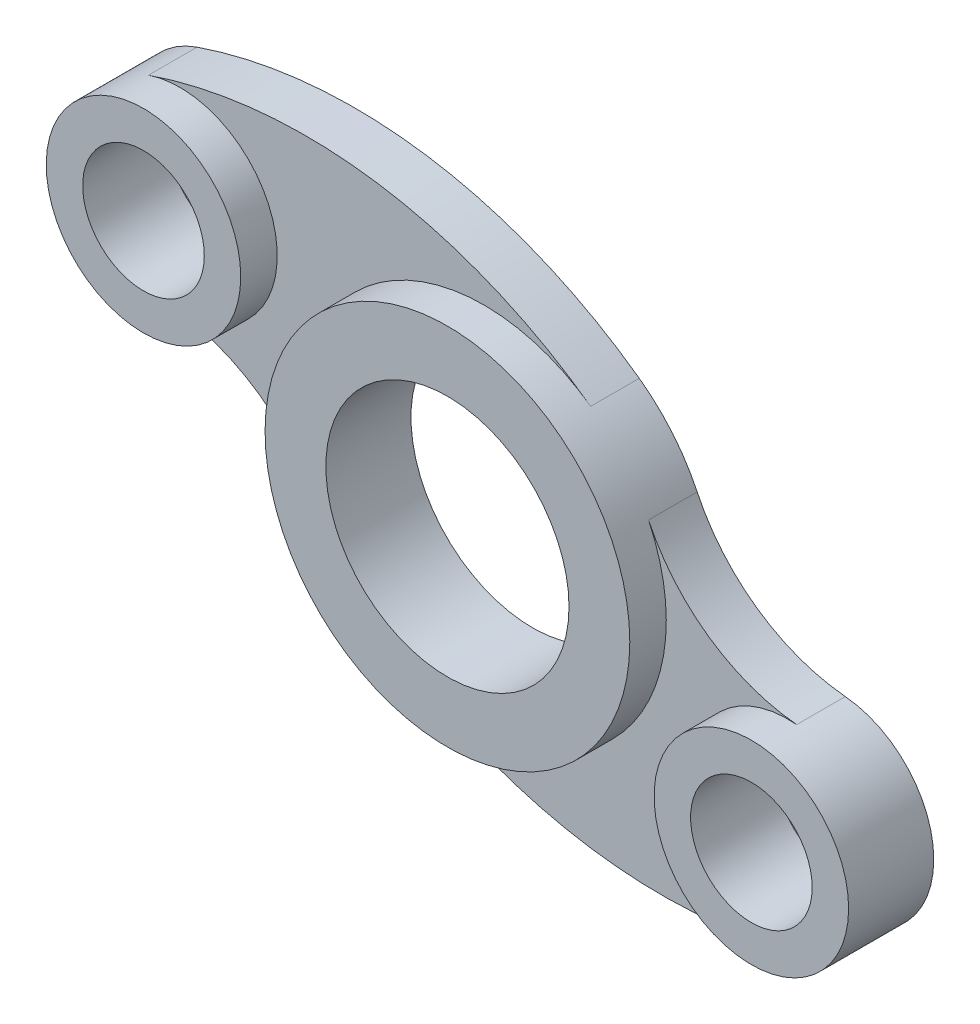
ISO-10303-21;
HEADER;
FILE_DESCRIPTION(('STEP AP214'),'2;1');
FILE_NAME('part.step','',(''),(''),'','','');
FILE_SCHEMA(('AUTOMOTIVE_DESIGN { 1 0 10303 214 1 1 1 1 }'));
ENDSEC;
DATA;
#1=APPLICATION_CONTEXT('core data for automotive mechanical design processes');
#2=APPLICATION_PROTOCOL_DEFINITION('international standard','automotive_design',2000,#1);
#3=PRODUCT_CONTEXT('',#1,'mechanical');
#4=PRODUCT('Part','Part','',(#3));
#5=PRODUCT_RELATED_PRODUCT_CATEGORY('part','',(#4));
#6=PRODUCT_DEFINITION_FORMATION('','',#4);
#7=PRODUCT_DEFINITION_CONTEXT('part definition',#1,'design');
#8=PRODUCT_DEFINITION('design','',#6,#7);
#9=PRODUCT_DEFINITION_SHAPE('','',#8);
#10=(LENGTH_UNIT() NAMED_UNIT(*) SI_UNIT(.MILLI.,.METRE.));
#11=(NAMED_UNIT(*) PLANE_ANGLE_UNIT() SI_UNIT($,.RADIAN.));
#12=(NAMED_UNIT(*) SI_UNIT($,.STERADIAN.) SOLID_ANGLE_UNIT());
#13=UNCERTAINTY_MEASURE_WITH_UNIT(LENGTH_MEASURE(1.E-05),#10,'distance_accuracy_value','');
#14=(GEOMETRIC_REPRESENTATION_CONTEXT(3) GLOBAL_UNCERTAINTY_ASSIGNED_CONTEXT((#13)) GLOBAL_UNIT_ASSIGNED_CONTEXT((#10,
#11,#12)) REPRESENTATION_CONTEXT('',''));
#15=CARTESIAN_POINT('',(0.,0.,0.));
#16=DIRECTION('',(0.,0.,1.));
#17=DIRECTION('',(1.,0.,0.));
#18=AXIS2_PLACEMENT_3D('',#15,#16,#17);
#19=CARTESIAN_POINT('',(0.,0.,14.));
#20=DIRECTION('',(0.,0.,-1.));
#21=DIRECTION('',(-1.,0.,0.));
#22=AXIS2_PLACEMENT_3D('',#19,#20,#21);
#23=CYLINDRICAL_SURFACE('',#22,30.);
#24=CARTESIAN_POINT('',(0.,0.,14.));
#25=DIRECTION('',(0.,0.,1.));
#26=DIRECTION('',(1.,0.,0.));
#27=AXIS2_PLACEMENT_3D('',#24,#25,#26);
#28=CIRCLE('',#27,30.);
#29=CARTESIAN_POINT('',(30.,0.,14.));
#30=VERTEX_POINT('',#29);
#31=EDGE_CURVE('E183',#30,#30,#28,.T.);
#32=ORIENTED_EDGE('',*,*,#31,.F.);
#33=EDGE_LOOP('',(#32));
#34=FACE_BOUND('',#33,.T.);
#35=DIRECTION('',(0.,0.,-1.));
#36=VECTOR('',#35,1.);
#37=CARTESIAN_POINT('',(-17.5549663072252,-24.3274157680628,8.));
#38=LINE('',#37,#36);
#39=CARTESIAN_POINT('',(-17.5549663072251,-24.3274157680627,8.));
#40=VERTEX_POINT('',#39);
#41=CARTESIAN_POINT('',(-17.5549663072252,-24.3274157680628,0.));
#42=VERTEX_POINT('',#41);
#43=EDGE_CURVE('E90',#40,#42,#38,.T.);
#44=ORIENTED_EDGE('',*,*,#43,.F.);
#45=CARTESIAN_POINT('',(0.,0.,8.));
#46=DIRECTION('',(0.,0.,1.));
#47=DIRECTION('',(1.,0.,0.));
#48=AXIS2_PLACEMENT_3D('',#45,#46,#47);
#49=CIRCLE('',#48,30.);
#50=CARTESIAN_POINT('',(27.0822211716785,12.9055529291963,8.));
#51=VERTEX_POINT('',#50);
#52=EDGE_CURVE('E85',#40,#51,#49,.T.);
#53=ORIENTED_EDGE('',*,*,#52,.T.);
#54=DIRECTION('',(0.,0.,-1.));
#55=VECTOR('',#54,1.);
#56=CARTESIAN_POINT('',(27.0822211716785,12.9055529291963,8.));
#57=LINE('',#56,#55);
#58=CARTESIAN_POINT('',(27.0822211716785,12.9055529291963,0.));
#59=VERTEX_POINT('',#58);
#60=EDGE_CURVE('E174',#51,#59,#57,.T.);
#61=ORIENTED_EDGE('',*,*,#60,.T.);
#62=CARTESIAN_POINT('',(0.,0.,0.));
#63=DIRECTION('',(0.,0.,1.));
#64=DIRECTION('',(1.,0.,0.));
#65=AXIS2_PLACEMENT_3D('',#62,#63,#64);
#66=CIRCLE('',#65,30.);
#67=CARTESIAN_POINT('',(17.5549663072251,24.3274157680628,0.));
#68=VERTEX_POINT('',#67);
#69=EDGE_CURVE('E192',#59,#68,#66,.T.);
#70=ORIENTED_EDGE('',*,*,#69,.T.);
#71=DIRECTION('',(0.,0.,-1.));
#72=VECTOR('',#71,1.);
#73=CARTESIAN_POINT('',(17.5549663072251,24.3274157680628,8.));
#74=LINE('',#73,#72);
#75=CARTESIAN_POINT('',(17.5549663072251,24.3274157680628,8.));
#76=VERTEX_POINT('',#75);
#77=EDGE_CURVE('E220',#76,#68,#74,.T.);
#78=ORIENTED_EDGE('',*,*,#77,.F.);
#79=CARTESIAN_POINT('',(0.,0.,8.));
#80=DIRECTION('',(0.,0.,1.));
#81=DIRECTION('',(1.,0.,0.));
#82=AXIS2_PLACEMENT_3D('',#79,#80,#81);
#83=CIRCLE('',#82,30.);
#84=CARTESIAN_POINT('',(-27.0822211716785,-12.9055529291963,8.));
#85=VERTEX_POINT('',#84);
#86=EDGE_CURVE('E203',#76,#85,#83,.T.);
#87=ORIENTED_EDGE('',*,*,#86,.T.);
#88=DIRECTION('',(0.,0.,-1.));
#89=VECTOR('',#88,1.);
#90=CARTESIAN_POINT('',(-27.0822211716785,-12.9055529291963,8.));
#91=LINE('',#90,#89);
#92=CARTESIAN_POINT('',(-27.0822211716785,-12.9055529291963,0.));
#93=VERTEX_POINT('',#92);
#94=EDGE_CURVE('E224',#85,#93,#91,.T.);
#95=ORIENTED_EDGE('',*,*,#94,.T.);
#96=EDGE_CURVE('E184',#93,#42,#66,.T.);
#97=ORIENTED_EDGE('',*,*,#96,.T.);
#98=EDGE_LOOP('',(#44,#53,#61,#70,#78,#87,#95,#97));
#99=FACE_BOUND('',#98,.T.);
#100=ADVANCED_FACE('F67',(#34,#99),#23,.T.);
#101=CARTESIAN_POINT('',(-50.,20.,14.));
#102=DIRECTION('',(0.,0.,-1.));
#103=DIRECTION('',(-1.,0.,0.));
#104=AXIS2_PLACEMENT_3D('',#101,#102,#103);
#105=CYLINDRICAL_SURFACE('',#104,16.);
#106=CARTESIAN_POINT('',(-50.,20.,14.));
#107=DIRECTION('',(0.,0.,1.));
#108=DIRECTION('',(1.,0.,0.));
#109=AXIS2_PLACEMENT_3D('',#106,#107,#108);
#110=CIRCLE('',#109,16.);
#111=CARTESIAN_POINT('',(-34.,20.,14.));
#112=VERTEX_POINT('',#111);
#113=EDGE_CURVE('E12',#112,#112,#110,.T.);
#114=ORIENTED_EDGE('',*,*,#113,.F.);
#115=EDGE_LOOP('',(#114));
#116=FACE_BOUND('',#115,.T.);
#117=DIRECTION('',(0.,0.,-1.));
#118=VECTOR('',#117,1.);
#119=CARTESIAN_POINT('',(-51.4485016846459,4.06570231012429,8.));
#120=LINE('',#119,#118);
#121=CARTESIAN_POINT('',(-51.4485016846459,4.06570231012431,8.));
#122=VERTEX_POINT('',#121);
#123=CARTESIAN_POINT('',(-51.4485016846459,4.06570231012429,0.));
#124=VERTEX_POINT('',#123);
#125=EDGE_CURVE('E228',#122,#124,#120,.T.);
#126=ORIENTED_EDGE('',*,*,#125,.F.);
#127=CARTESIAN_POINT('',(-50.,20.,8.));
#128=DIRECTION('',(0.,0.,1.));
#129=DIRECTION('',(1.,0.,0.));
#130=AXIS2_PLACEMENT_3D('',#127,#128,#129);
#131=CIRCLE('',#130,16.);
#132=CARTESIAN_POINT('',(-55.1854307053229,35.1364232366928,8.));
#133=VERTEX_POINT('',#132);
#134=EDGE_CURVE('E195',#122,#133,#131,.T.);
#135=ORIENTED_EDGE('',*,*,#134,.T.);
#136=DIRECTION('',(0.,0.,-1.));
#137=VECTOR('',#136,1.);
#138=CARTESIAN_POINT('',(-55.1854307053229,35.1364232366929,8.));
#139=LINE('',#138,#137);
#140=CARTESIAN_POINT('',(-55.1854307053229,35.1364232366929,0.));
#141=VERTEX_POINT('',#140);
#142=EDGE_CURVE('E211',#133,#141,#139,.T.);
#143=ORIENTED_EDGE('',*,*,#142,.T.);
#144=CARTESIAN_POINT('',(-50.,20.,0.));
#145=DIRECTION('',(0.,0.,1.));
#146=DIRECTION('',(1.,0.,0.));
#147=AXIS2_PLACEMENT_3D('',#144,#145,#146);
#148=CIRCLE('',#147,16.);
#149=EDGE_CURVE('E71',#141,#124,#148,.T.);
#150=ORIENTED_EDGE('',*,*,#149,.T.);
#151=EDGE_LOOP('',(#126,#135,#143,#150));
#152=FACE_BOUND('',#151,.T.);
#153=ADVANCED_FACE('F241',(#116,#152),#105,.T.);
#154=CARTESIAN_POINT('',(-50.,20.,14.));
#155=DIRECTION('',(0.,0.,-1.));
#156=DIRECTION('',(-1.,0.,0.));
#157=AXIS2_PLACEMENT_3D('',#154,#155,#156);
#158=CYLINDRICAL_SURFACE('',#157,10.);
#159=CARTESIAN_POINT('',(-50.,20.,14.));
#160=DIRECTION('',(0.,0.,1.));
#161=DIRECTION('',(1.,0.,0.));
#162=AXIS2_PLACEMENT_3D('',#159,#160,#161);
#163=CIRCLE('',#162,10.);
#164=CARTESIAN_POINT('',(-40.,20.,14.));
#165=VERTEX_POINT('',#164);
#166=EDGE_CURVE('E77',#165,#165,#163,.T.);
#167=ORIENTED_EDGE('',*,*,#166,.T.);
#168=EDGE_LOOP('',(#167));
#169=FACE_BOUND('',#168,.T.);
#170=CARTESIAN_POINT('',(-50.,20.,0.));
#171=DIRECTION('',(0.,0.,1.));
#172=DIRECTION('',(1.,0.,0.));
#173=AXIS2_PLACEMENT_3D('',#170,#171,#172);
#174=CIRCLE('',#173,10.);
#175=CARTESIAN_POINT('',(-40.,20.,0.));
#176=VERTEX_POINT('',#175);
#177=EDGE_CURVE('E232',#176,#176,#174,.T.);
#178=ORIENTED_EDGE('',*,*,#177,.F.);
#179=EDGE_LOOP('',(#178));
#180=FACE_BOUND('',#179,.T.);
#181=ADVANCED_FACE('F69',(#169,#180),#158,.F.);
#182=CARTESIAN_POINT('',(0.,0.,14.));
#183=DIRECTION('',(0.,0.,1.));
#184=DIRECTION('',(1.,0.,0.));
#185=AXIS2_PLACEMENT_3D('',#182,#183,#184);
#186=PLANE('',#185);
#187=ORIENTED_EDGE('',*,*,#166,.F.);
#188=EDGE_LOOP('',(#187));
#189=FACE_BOUND('',#188,.T.);
#190=ORIENTED_EDGE('',*,*,#113,.T.);
#191=EDGE_LOOP('',(#190));
#192=FACE_BOUND('',#191,.T.);
#193=ADVANCED_FACE('F293',(#189,#192),#186,.T.);
#194=CARTESIAN_POINT('',(0.,0.,0.));
#195=DIRECTION('',(0.,0.,1.));
#196=DIRECTION('',(1.,0.,0.));
#197=AXIS2_PLACEMENT_3D('',#194,#195,#196);
#198=PLANE('',#197);
#199=ORIENTED_EDGE('',*,*,#177,.T.);
#200=EDGE_LOOP('',(#199));
#201=FACE_BOUND('',#200,.T.);
#202=ORIENTED_EDGE('',*,*,#149,.F.);
#203=CARTESIAN_POINT('',(-29.2582771787086,-40.5456929467713,0.));
#204=DIRECTION('',(0.,0.,1.));
#205=DIRECTION('',(1.,0.,0.));
#206=AXIS2_PLACEMENT_3D('',#203,#204,#205);
#207=CIRCLE('',#206,80.);
#208=EDGE_CURVE('E199',#141,#68,#207,.F.);
#209=ORIENTED_EDGE('',*,*,#208,.T.);
#210=ORIENTED_EDGE('',*,*,#69,.F.);
#211=CARTESIAN_POINT('',(54.164442343357,25.8111058583926,0.));
#212=DIRECTION('',(0.,0.,1.));
#213=DIRECTION('',(1.,0.,0.));
#214=AXIS2_PLACEMENT_3D('',#211,#212,#213);
#215=CIRCLE('',#214,30.);
#216=CARTESIAN_POINT('',(51.4485016846459,-4.06570231012431,0.));
#217=VERTEX_POINT('',#216);
#218=EDGE_CURVE('E142',#217,#59,#215,.F.);
#219=ORIENTED_EDGE('',*,*,#218,.F.);
#220=CARTESIAN_POINT('',(50.,-20.,0.));
#221=DIRECTION('',(0.,0.,1.));
#222=DIRECTION('',(1.,0.,0.));
#223=AXIS2_PLACEMENT_3D('',#220,#221,#222);
#224=CIRCLE('',#223,16.);
#225=CARTESIAN_POINT('',(55.1854307053229,-35.1364232366928,0.));
#226=VERTEX_POINT('',#225);
#227=EDGE_CURVE('E462',#226,#217,#224,.T.);
#228=ORIENTED_EDGE('',*,*,#227,.F.);
#229=CARTESIAN_POINT('',(29.2582771787086,40.5456929467713,0.));
#230=DIRECTION('',(0.,0.,1.));
#231=DIRECTION('',(1.,0.,0.));
#232=AXIS2_PLACEMENT_3D('',#229,#230,#231);
#233=CIRCLE('',#232,80.);
#234=EDGE_CURVE('E148',#226,#42,#233,.F.);
#235=ORIENTED_EDGE('',*,*,#234,.T.);
#236=ORIENTED_EDGE('',*,*,#96,.F.);
#237=CARTESIAN_POINT('',(-54.1644423433571,-25.8111058583927,0.));
#238=DIRECTION('',(0.,0.,1.));
#239=DIRECTION('',(1.,0.,0.));
#240=AXIS2_PLACEMENT_3D('',#237,#238,#239);
#241=CIRCLE('',#240,30.);
#242=EDGE_CURVE('E188',#124,#93,#241,.F.);
#243=ORIENTED_EDGE('',*,*,#242,.F.);
#244=EDGE_LOOP('',(#202,#209,#210,#219,#228,#235,#236,#243));
#245=FACE_BOUND('',#244,.T.);
#246=CARTESIAN_POINT('',(0.,0.,0.));
#247=DIRECTION('',(0.,0.,1.));
#248=DIRECTION('',(1.,0.,0.));
#249=AXIS2_PLACEMENT_3D('',#246,#247,#248);
#250=CIRCLE('',#249,20.);
#251=CARTESIAN_POINT('',(20.,0.,0.));
#252=VERTEX_POINT('',#251);
#253=EDGE_CURVE('E153',#252,#252,#250,.T.);
#254=ORIENTED_EDGE('',*,*,#253,.T.);
#255=EDGE_LOOP('',(#254));
#256=FACE_BOUND('',#255,.T.);
#257=CARTESIAN_POINT('',(50.,-20.,0.));
#258=DIRECTION('',(0.,0.,1.));
#259=DIRECTION('',(1.,0.,0.));
#260=AXIS2_PLACEMENT_3D('',#257,#258,#259);
#261=CIRCLE('',#260,10.);
#262=CARTESIAN_POINT('',(60.,-20.,0.));
#263=VERTEX_POINT('',#262);
#264=EDGE_CURVE('E465',#263,#263,#261,.T.);
#265=ORIENTED_EDGE('',*,*,#264,.T.);
#266=EDGE_LOOP('',(#265));
#267=FACE_BOUND('',#266,.T.);
#268=ADVANCED_FACE('F251',(#201,#245,#256,#267),#198,.F.);
#269=CARTESIAN_POINT('',(-54.1644423433571,-25.8111058583927,8.));
#270=DIRECTION('',(0.,0.,-1.));
#271=DIRECTION('',(-1.,0.,0.));
#272=AXIS2_PLACEMENT_3D('',#269,#270,#271);
#273=CYLINDRICAL_SURFACE('',#272,30.);
#274=ORIENTED_EDGE('',*,*,#242,.T.);
#275=ORIENTED_EDGE('',*,*,#94,.F.);
#276=CARTESIAN_POINT('',(-54.1644423433571,-25.8111058583927,8.));
#277=DIRECTION('',(0.,0.,1.));
#278=DIRECTION('',(1.,0.,0.));
#279=AXIS2_PLACEMENT_3D('',#276,#277,#278);
#280=CIRCLE('',#279,30.);
#281=EDGE_CURVE('E198',#122,#85,#280,.F.);
#282=ORIENTED_EDGE('',*,*,#281,.F.);
#283=ORIENTED_EDGE('',*,*,#125,.T.);
#284=EDGE_LOOP('',(#274,#275,#282,#283));
#285=FACE_BOUND('',#284,.T.);
#286=ADVANCED_FACE('F248',(#285),#273,.F.);
#287=CARTESIAN_POINT('',(-29.2582771787086,-40.5456929467713,8.));
#288=DIRECTION('',(0.,0.,-1.));
#289=DIRECTION('',(-1.,0.,0.));
#290=AXIS2_PLACEMENT_3D('',#287,#288,#289);
#291=CYLINDRICAL_SURFACE('',#290,80.);
#292=ORIENTED_EDGE('',*,*,#208,.F.);
#293=ORIENTED_EDGE('',*,*,#142,.F.);
#294=CARTESIAN_POINT('',(-29.2582771787086,-40.5456929467713,8.));
#295=DIRECTION('',(0.,0.,1.));
#296=DIRECTION('',(1.,0.,0.));
#297=AXIS2_PLACEMENT_3D('',#294,#295,#296);
#298=CIRCLE('',#297,80.);
#299=EDGE_CURVE('E207',#133,#76,#298,.F.);
#300=ORIENTED_EDGE('',*,*,#299,.T.);
#301=ORIENTED_EDGE('',*,*,#77,.T.);
#302=EDGE_LOOP('',(#292,#293,#300,#301));
#303=FACE_BOUND('',#302,.T.);
#304=ADVANCED_FACE('F258',(#303),#291,.T.);
#305=CARTESIAN_POINT('',(0.,0.,8.));
#306=DIRECTION('',(0.,0.,1.));
#307=DIRECTION('',(1.,0.,0.));
#308=AXIS2_PLACEMENT_3D('',#305,#306,#307);
#309=PLANE('',#308);
#310=ORIENTED_EDGE('',*,*,#134,.F.);
#311=ORIENTED_EDGE('',*,*,#281,.T.);
#312=ORIENTED_EDGE('',*,*,#86,.F.);
#313=ORIENTED_EDGE('',*,*,#299,.F.);
#314=EDGE_LOOP('',(#310,#311,#312,#313));
#315=FACE_BOUND('',#314,.T.);
#316=ADVANCED_FACE('F255',(#315),#309,.T.);
#317=CARTESIAN_POINT('',(0.,0.,14.));
#318=DIRECTION('',(0.,0.,-1.));
#319=DIRECTION('',(-1.,0.,0.));
#320=AXIS2_PLACEMENT_3D('',#317,#318,#319);
#321=CYLINDRICAL_SURFACE('',#320,20.);
#322=CARTESIAN_POINT('',(0.,0.,14.));
#323=DIRECTION('',(0.,0.,1.));
#324=DIRECTION('',(1.,0.,0.));
#325=AXIS2_PLACEMENT_3D('',#322,#323,#324);
#326=CIRCLE('',#325,20.);
#327=CARTESIAN_POINT('',(20.,0.,14.));
#328=VERTEX_POINT('',#327);
#329=EDGE_CURVE('E179',#328,#328,#326,.T.);
#330=ORIENTED_EDGE('',*,*,#329,.T.);
#331=EDGE_LOOP('',(#330));
#332=FACE_BOUND('',#331,.T.);
#333=ORIENTED_EDGE('',*,*,#253,.F.);
#334=EDGE_LOOP('',(#333));
#335=FACE_BOUND('',#334,.T.);
#336=ADVANCED_FACE('F283',(#332,#335),#321,.F.);
#337=CARTESIAN_POINT('',(0.,0.,14.));
#338=DIRECTION('',(0.,0.,1.));
#339=DIRECTION('',(1.,0.,0.));
#340=AXIS2_PLACEMENT_3D('',#337,#338,#339);
#341=PLANE('',#340);
#342=ORIENTED_EDGE('',*,*,#329,.F.);
#343=EDGE_LOOP('',(#342));
#344=FACE_BOUND('',#343,.T.);
#345=ORIENTED_EDGE('',*,*,#31,.T.);
#346=EDGE_LOOP('',(#345));
#347=FACE_BOUND('',#346,.T.);
#348=ADVANCED_FACE('F271',(#344,#347),#341,.T.);
#349=CARTESIAN_POINT('',(29.2582771787086,40.5456929467713,8.));
#350=DIRECTION('',(0.,0.,-1.));
#351=DIRECTION('',(-1.,0.,0.));
#352=AXIS2_PLACEMENT_3D('',#349,#350,#351);
#353=CYLINDRICAL_SURFACE('',#352,80.);
#354=ORIENTED_EDGE('',*,*,#234,.F.);
#355=DIRECTION('',(0.,0.,-1.));
#356=VECTOR('',#355,1.);
#357=CARTESIAN_POINT('',(55.1854307053229,-35.1364232366928,8.));
#358=LINE('',#357,#356);
#359=CARTESIAN_POINT('',(55.1854307053229,-35.1364232366929,8.));
#360=VERTEX_POINT('',#359);
#361=EDGE_CURVE('E145',#360,#226,#358,.T.);
#362=ORIENTED_EDGE('',*,*,#361,.F.);
#363=CARTESIAN_POINT('',(29.2582771787086,40.5456929467713,8.));
#364=DIRECTION('',(0.,0.,1.));
#365=DIRECTION('',(1.,0.,0.));
#366=AXIS2_PLACEMENT_3D('',#363,#364,#365);
#367=CIRCLE('',#366,80.);
#368=EDGE_CURVE('E134',#360,#40,#367,.F.);
#369=ORIENTED_EDGE('',*,*,#368,.T.);
#370=ORIENTED_EDGE('',*,*,#43,.T.);
#371=EDGE_LOOP('',(#354,#362,#369,#370));
#372=FACE_BOUND('',#371,.T.);
#373=ADVANCED_FACE('F146',(#372),#353,.T.);
#374=CARTESIAN_POINT('',(54.164442343357,25.8111058583926,8.));
#375=DIRECTION('',(0.,0.,-1.));
#376=DIRECTION('',(-1.,0.,0.));
#377=AXIS2_PLACEMENT_3D('',#374,#375,#376);
#378=CYLINDRICAL_SURFACE('',#377,30.);
#379=ORIENTED_EDGE('',*,*,#218,.T.);
#380=ORIENTED_EDGE('',*,*,#60,.F.);
#381=CARTESIAN_POINT('',(54.164442343357,25.8111058583926,8.));
#382=DIRECTION('',(0.,0.,1.));
#383=DIRECTION('',(1.,0.,0.));
#384=AXIS2_PLACEMENT_3D('',#381,#382,#383);
#385=CIRCLE('',#384,30.);
#386=CARTESIAN_POINT('',(51.4485016846459,-4.06570231012431,8.));
#387=VERTEX_POINT('',#386);
#388=EDGE_CURVE('E158',#387,#51,#385,.F.);
#389=ORIENTED_EDGE('',*,*,#388,.F.);
#390=DIRECTION('',(0.,0.,-1.));
#391=VECTOR('',#390,1.);
#392=CARTESIAN_POINT('',(51.4485016846459,-4.06570231012431,8.));
#393=LINE('',#392,#391);
#394=EDGE_CURVE('E154',#387,#217,#393,.T.);
#395=ORIENTED_EDGE('',*,*,#394,.T.);
#396=EDGE_LOOP('',(#379,#380,#389,#395));
#397=FACE_BOUND('',#396,.T.);
#398=ADVANCED_FACE('F263',(#397),#378,.F.);
#399=CARTESIAN_POINT('',(0.,0.,8.));
#400=DIRECTION('',(0.,0.,1.));
#401=DIRECTION('',(1.,0.,0.));
#402=AXIS2_PLACEMENT_3D('',#399,#400,#401);
#403=PLANE('',#402);
#404=ORIENTED_EDGE('',*,*,#368,.F.);
#405=CARTESIAN_POINT('',(50.,-20.,8.));
#406=DIRECTION('',(0.,0.,1.));
#407=DIRECTION('',(1.,0.,0.));
#408=AXIS2_PLACEMENT_3D('',#405,#406,#407);
#409=CIRCLE('',#408,16.);
#410=EDGE_CURVE('E138',#387,#360,#409,.T.);
#411=ORIENTED_EDGE('',*,*,#410,.F.);
#412=ORIENTED_EDGE('',*,*,#388,.T.);
#413=ORIENTED_EDGE('',*,*,#52,.F.);
#414=EDGE_LOOP('',(#404,#411,#412,#413));
#415=FACE_BOUND('',#414,.T.);
#416=ADVANCED_FACE('F136',(#415),#403,.T.);
#417=CARTESIAN_POINT('',(50.,-20.,14.));
#418=DIRECTION('',(0.,0.,-1.));
#419=DIRECTION('',(-1.,0.,0.));
#420=AXIS2_PLACEMENT_3D('',#417,#418,#419);
#421=CYLINDRICAL_SURFACE('',#420,16.);
#422=CARTESIAN_POINT('',(50.,-20.,14.));
#423=DIRECTION('',(0.,0.,1.));
#424=DIRECTION('',(1.,0.,0.));
#425=AXIS2_PLACEMENT_3D('',#422,#423,#424);
#426=CIRCLE('',#425,16.);
#427=CARTESIAN_POINT('',(66.,-20.,14.));
#428=VERTEX_POINT('',#427);
#429=EDGE_CURVE('E168',#428,#428,#426,.T.);
#430=ORIENTED_EDGE('',*,*,#429,.F.);
#431=EDGE_LOOP('',(#430));
#432=FACE_BOUND('',#431,.T.);
#433=ORIENTED_EDGE('',*,*,#410,.T.);
#434=ORIENTED_EDGE('',*,*,#361,.T.);
#435=ORIENTED_EDGE('',*,*,#227,.T.);
#436=ORIENTED_EDGE('',*,*,#394,.F.);
#437=EDGE_LOOP('',(#433,#434,#435,#436));
#438=FACE_BOUND('',#437,.T.);
#439=ADVANCED_FACE('F156',(#432,#438),#421,.T.);
#440=CARTESIAN_POINT('',(50.,-20.,14.));
#441=DIRECTION('',(0.,0.,-1.));
#442=DIRECTION('',(-1.,0.,0.));
#443=AXIS2_PLACEMENT_3D('',#440,#441,#442);
#444=CYLINDRICAL_SURFACE('',#443,10.);
#445=CARTESIAN_POINT('',(50.,-20.,14.));
#446=DIRECTION('',(0.,0.,1.));
#447=DIRECTION('',(1.,0.,0.));
#448=AXIS2_PLACEMENT_3D('',#445,#446,#447);
#449=CIRCLE('',#448,10.);
#450=CARTESIAN_POINT('',(60.,-20.,14.));
#451=VERTEX_POINT('',#450);
#452=EDGE_CURVE('E456',#451,#451,#449,.T.);
#453=ORIENTED_EDGE('',*,*,#452,.T.);
#454=EDGE_LOOP('',(#453));
#455=FACE_BOUND('',#454,.T.);
#456=ORIENTED_EDGE('',*,*,#264,.F.);
#457=EDGE_LOOP('',(#456));
#458=FACE_BOUND('',#457,.T.);
#459=ADVANCED_FACE('F352',(#455,#458),#444,.F.);
#460=CARTESIAN_POINT('',(0.,0.,14.));
#461=DIRECTION('',(0.,0.,1.));
#462=DIRECTION('',(1.,0.,0.));
#463=AXIS2_PLACEMENT_3D('',#460,#461,#462);
#464=PLANE('',#463);
#465=ORIENTED_EDGE('',*,*,#452,.F.);
#466=EDGE_LOOP('',(#465));
#467=FACE_BOUND('',#466,.T.);
#468=ORIENTED_EDGE('',*,*,#429,.T.);
#469=EDGE_LOOP('',(#468));
#470=FACE_BOUND('',#469,.T.);
#471=ADVANCED_FACE('F365',(#467,#470),#464,.T.);
#472=CLOSED_SHELL('',(#100,#153,#181,#193,#268,#286,#304,#316,#336,#348,#373,#398,#416,#439,
#459,#471));
#473=MANIFOLD_SOLID_BREP('B2',#472);
#474=ADVANCED_BREP_SHAPE_REPRESENTATION('',(#18,#473),#14);
#475=SHAPE_DEFINITION_REPRESENTATION(#9,#474);
ENDSEC;
END-ISO-10303-21;
